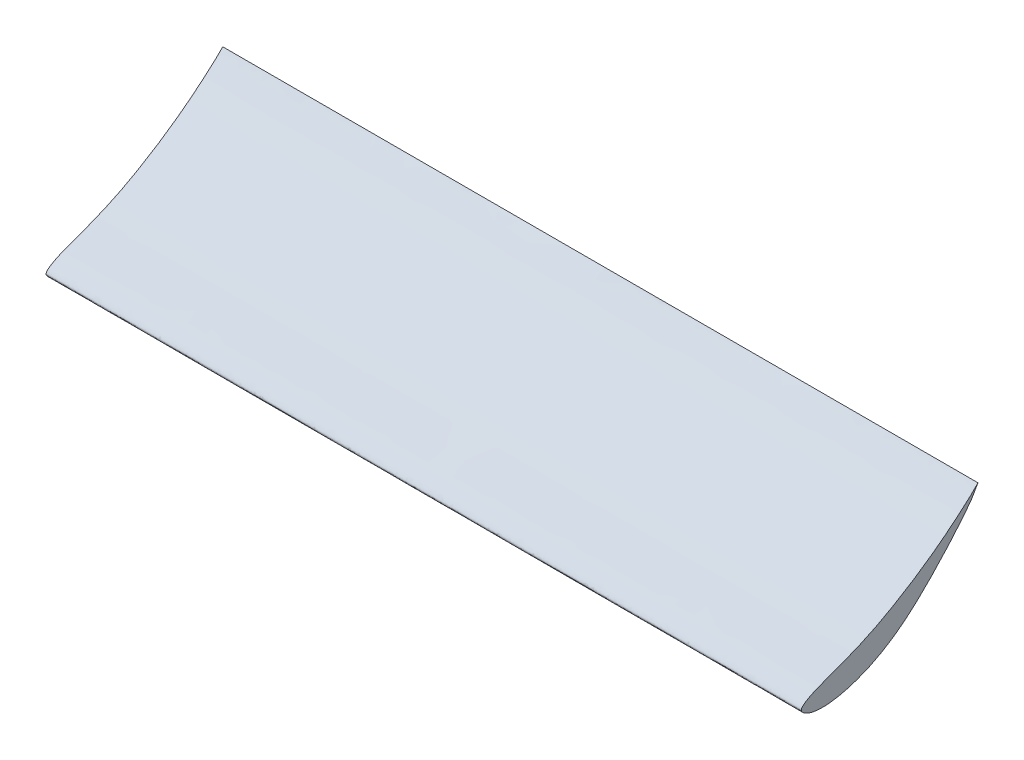
ISO-10303-21;
HEADER;
FILE_DESCRIPTION(('STEP AP214'),'2;1');
FILE_NAME('part.step','',(''),(''),'','','');
FILE_SCHEMA(('AUTOMOTIVE_DESIGN { 1 0 10303 214 1 1 1 1 }'));
ENDSEC;
DATA;
#1=APPLICATION_CONTEXT('core data for automotive mechanical design processes');
#2=APPLICATION_PROTOCOL_DEFINITION('international standard','automotive_design',2000,#1);
#3=PRODUCT_CONTEXT('',#1,'mechanical');
#4=PRODUCT('Part','Part','',(#3));
#5=PRODUCT_RELATED_PRODUCT_CATEGORY('part','',(#4));
#6=PRODUCT_DEFINITION_FORMATION('','',#4);
#7=PRODUCT_DEFINITION_CONTEXT('part definition',#1,'design');
#8=PRODUCT_DEFINITION('design','',#6,#7);
#9=PRODUCT_DEFINITION_SHAPE('','',#8);
#10=(LENGTH_UNIT() NAMED_UNIT(*) SI_UNIT(.MILLI.,.METRE.));
#11=(NAMED_UNIT(*) PLANE_ANGLE_UNIT() SI_UNIT($,.RADIAN.));
#12=(NAMED_UNIT(*) SI_UNIT($,.STERADIAN.) SOLID_ANGLE_UNIT());
#13=UNCERTAINTY_MEASURE_WITH_UNIT(LENGTH_MEASURE(1.E-05),#10,'distance_accuracy_value','');
#14=(GEOMETRIC_REPRESENTATION_CONTEXT(3) GLOBAL_UNCERTAINTY_ASSIGNED_CONTEXT((#13)) GLOBAL_UNIT_ASSIGNED_CONTEXT((#10,
#11,#12)) REPRESENTATION_CONTEXT('',''));
#15=CARTESIAN_POINT('',(0.,0.,0.));
#16=DIRECTION('',(0.,0.,1.));
#17=DIRECTION('',(1.,0.,0.));
#18=AXIS2_PLACEMENT_3D('',#15,#16,#17);
#19=CARTESIAN_POINT('',(-508.,983.23183406811,-902.866032271416));
#20=DIRECTION('',(-1.,0.,0.));
#21=DIRECTION('',(0.,0.,1.));
#22=AXIS2_PLACEMENT_3D('',#19,#20,#21);
#23=PLANE('',#22);
#24=CARTESIAN_POINT('',(-508.,1136.500000046,-1133.2478951966));
#25=CARTESIAN_POINT('',(-508.,1136.51866205503,-1133.22940707));
#26=CARTESIAN_POINT('',(-508.,1134.76729407548,-1131.73738322467));
#27=CARTESIAN_POINT('',(-508.,1133.14865361785,-1130.04521312581));
#28=CARTESIAN_POINT('',(-508.,1129.16246906123,-1126.03283655878));
#29=CARTESIAN_POINT('',(-508.,1124.47580071429,-1120.93333634314));
#30=CARTESIAN_POINT('',(-508.,1118.44426676079,-1114.21213755127));
#31=CARTESIAN_POINT('',(-508.,1111.46914157634,-1106.14181380977));
#32=CARTESIAN_POINT('',(-508.,1103.59085152631,-1096.66531267338));
#33=CARTESIAN_POINT('',(-508.,1094.99661592395,-1085.87423454851));
#34=CARTESIAN_POINT('',(-508.,1085.8664057438,-1073.8426942592));
#35=CARTESIAN_POINT('',(-508.,1076.45564659389,-1060.67966671591));
#36=CARTESIAN_POINT('',(-508.,1066.99203007372,-1046.56526822842));
#37=CARTESIAN_POINT('',(-508.,1057.62710879863,-1031.73778080715));
#38=CARTESIAN_POINT('',(-508.,1048.52286332666,-1016.40919832579));
#39=CARTESIAN_POINT('',(-508.,1039.89403724533,-1000.79537704153));
#40=CARTESIAN_POINT('',(-508.,1032.09727696124,-985.148163597457));
#41=CARTESIAN_POINT('',(-508.,1025.31827723405,-969.885579530069));
#42=CARTESIAN_POINT('',(-508.,1019.49450613905,-955.489755196973));
#43=CARTESIAN_POINT('',(-508.,1014.57372401878,-942.326496264695));
#44=CARTESIAN_POINT('',(-508.,1010.42738715633,-930.668912346977));
#45=CARTESIAN_POINT('',(-508.,1006.73545630894,-920.709876051195));
#46=CARTESIAN_POINT('',(-508.,1003.30962973556,-912.488425414251));
#47=CARTESIAN_POINT('',(-508.,1000.11328499534,-905.924711836648));
#48=CARTESIAN_POINT('',(-508.,997.12209295586,-900.987613441477));
#49=CARTESIAN_POINT('',(-508.,994.848485081599,-898.105542312802));
#50=CARTESIAN_POINT('',(-508.,993.323061343934,-896.747220150379));
#51=CARTESIAN_POINT('',(-508.,992.695678509163,-896.262963388353));
#52=CARTESIAN_POINT('',(-508.,992.128471885305,-895.906132308792));
#53=CARTESIAN_POINT('',(-508.,991.74202912273,-895.703357721575));
#54=CARTESIAN_POINT('',(-508.,991.439913457428,-895.58976608859));
#55=CARTESIAN_POINT('',(-508.,991.228782623257,-895.522464552237));
#56=CARTESIAN_POINT('',(-508.,991.020214241511,-895.477266270503));
#57=CARTESIAN_POINT('',(-508.,990.810606980497,-895.468104938629));
#58=CARTESIAN_POINT('',(-508.,990.597176067395,-895.477187864337));
#59=CARTESIAN_POINT('',(-508.,990.302571432088,-895.521281629362));
#60=CARTESIAN_POINT('',(-508.,989.921640587498,-895.605761956951));
#61=CARTESIAN_POINT('',(-508.,989.376327617136,-895.801661540054));
#62=CARTESIAN_POINT('',(-508.,988.324502311541,-896.307224772996));
#63=CARTESIAN_POINT('',(-508.,986.580020905351,-897.682020107552));
#64=CARTESIAN_POINT('',(-508.,984.731799572414,-900.007794247464));
#65=CARTESIAN_POINT('',(-508.,983.666890362432,-901.948697229946));
#66=CARTESIAN_POINT('',(-508.,983.23183406811,-902.866032271416));
#67=(BOUNDED_CURVE() B_SPLINE_CURVE(3,(#24,#25,#26,#27,#28,#29,#30,#31,#32,#33,#34,#35,#36,#37,
#38,#39,#40,#41,#42,#43,#44,#45,#46,#47,#48,#49,#50,#51,#52,#53,#54,#55,#56,#57,#58,#59,#60,#61,
#62,#63,#64,#65,#66),.UNSPECIFIED.,.F.,.F.) B_SPLINE_CURVE_WITH_KNOTS((4,1,1,1,1,1,1,1,1,1,1,1,
1,1,1,1,1,1,1,1,1,1,1,1,1,1,1,1,1,1,1,1,1,1,1,1,1,1,1,1,4),(0.,0.00184117619079416,
0.00730848433221432,0.016237150684669,0.0284563248120514,0.0438013684366982,0.0621258274692258,
0.0832395532130718,0.106895519252796,0.132816624078713,0.160612712000671,0.189791010160819,
0.219873156169979,0.250457487037601,0.28112655590443,0.311256566368928,0.339998753430789,
0.366671480309786,0.390812035384013,0.411995107228008,0.430068720119567,0.445223789458553,
0.457619352285403,0.467425396221126,0.474786479626527,0.476279684730584,0.477883716925066,
0.478839791717239,0.479711359314481,0.480113154439697,0.480492023942477,0.48084645603417,
0.481202586512776,0.481563638127212,0.481939611769679,0.482727347846705,0.483558571629405,
0.484902837311291,0.488691658546686,0.494806065890377,0.5),
.UNSPECIFIED.) CURVE() GEOMETRIC_REPRESENTATION_ITEM() RATIONAL_B_SPLINE_CURVE((1.,1.,1.,1.,1.,
1.,1.,1.,1.,1.,1.,1.,1.,1.,1.,1.,1.,1.,1.,1.,1.,1.,1.,1.,1.,1.,1.,1.,1.,1.,1.,1.,1.,1.,1.,1.,1.,
1.,1.,1.,1.,1.,1.)) REPRESENTATION_ITEM(''));
#68=CARTESIAN_POINT('',(-508.,1136.500000046,-1133.2478951966));
#69=VERTEX_POINT('',#68);
#70=CARTESIAN_POINT('',(-508.,983.23183406811,-902.866032271416));
#71=VERTEX_POINT('',#70);
#72=EDGE_CURVE('E10',#69,#71,#67,.T.);
#73=ORIENTED_EDGE('',*,*,#72,.F.);
#74=CARTESIAN_POINT('',(-508.,983.23183406811,-902.866032271416));
#75=CARTESIAN_POINT('',(-508.,983.051794016204,-903.245654519471));
#76=CARTESIAN_POINT('',(-508.,982.193962185146,-905.174738908225));
#77=CARTESIAN_POINT('',(-508.,980.947491558145,-909.044621195438));
#78=CARTESIAN_POINT('',(-508.,979.870416154282,-914.795542365219));
#79=CARTESIAN_POINT('',(-508.,979.346135741337,-921.395591653794));
#80=CARTESIAN_POINT('',(-508.,979.429810957453,-928.776843337677));
#81=CARTESIAN_POINT('',(-508.,980.159041889332,-936.860781778271));
#82=CARTESIAN_POINT('',(-508.,981.563117839808,-945.564210018201));
#83=CARTESIAN_POINT('',(-508.,983.658288216997,-954.794977359482));
#84=CARTESIAN_POINT('',(-508.,986.455957132716,-964.453768835694));
#85=CARTESIAN_POINT('',(-508.,989.95151803178,-974.43570168517));
#86=CARTESIAN_POINT('',(-508.,994.146079418227,-984.631289751938));
#87=CARTESIAN_POINT('',(-508.,999.067064719455,-994.928463859717));
#88=CARTESIAN_POINT('',(-508.,1004.71077269264,-1005.23476562102));
#89=CARTESIAN_POINT('',(-508.,1011.06861436425,-1015.47490404744));
#90=CARTESIAN_POINT('',(-508.,1018.12967538531,-1025.5791208222));
#91=CARTESIAN_POINT('',(-508.,1025.88232833701,-1035.50248612597));
#92=CARTESIAN_POINT('',(-508.,1034.28184113422,-1045.21746008474));
#93=CARTESIAN_POINT('',(-508.,1043.15012909835,-1054.77205505592));
#94=CARTESIAN_POINT('',(-508.,1052.32466752318,-1064.1447414051));
#95=CARTESIAN_POINT('',(-508.,1061.65160830308,-1073.25399801771));
#96=CARTESIAN_POINT('',(-508.,1070.96289931065,-1082.02526393335));
#97=CARTESIAN_POINT('',(-508.,1080.09941585938,-1090.37127690747));
#98=CARTESIAN_POINT('',(-508.,1088.91431720843,-1098.19257457962));
#99=CARTESIAN_POINT('',(-508.,1097.26041144891,-1105.39647498838));
#100=CARTESIAN_POINT('',(-508.,1105.00816359892,-1111.87692251879));
#101=CARTESIAN_POINT('',(-508.,1112.05162823055,-1117.54059155859));
#102=CARTESIAN_POINT('',(-508.,1118.31282016739,-1122.28985209627));
#103=CARTESIAN_POINT('',(-508.,1123.94756936492,-1126.05528055917));
#104=CARTESIAN_POINT('',(-508.,1128.69826829572,-1128.73587721306));
#105=CARTESIAN_POINT('',(-508.,1132.83122267032,-1131.03774052774));
#106=CARTESIAN_POINT('',(-508.,1134.71203322922,-1132.01470797932));
#107=CARTESIAN_POINT('',(-508.,1136.48162676212,-1133.26609728824));
#108=CARTESIAN_POINT('',(-508.,1136.500000046,-1133.2478951966));
#109=(BOUNDED_CURVE() B_SPLINE_CURVE(3,(#74,#75,#76,#77,#78,#79,#80,#81,#82,#83,#84,#85,#86,#87,
#88,#89,#90,#91,#92,#93,#94,#95,#96,#97,#98,#99,#100,#101,#102,#103,#104,#105,#106,#107,#108),
.UNSPECIFIED.,.F.,.F.) B_SPLINE_CURVE_WITH_KNOTS((4,1,1,1,1,1,1,1,1,1,1,1,1,1,1,1,1,1,1,1,1,1,1,
1,1,1,1,1,1,1,1,1,4),(0.5,0.50214941417673,0.51079641033661,0.52076411711489,0.532061880680993,
0.544665778051845,0.558541303758952,0.573611819486058,0.589802913486935,0.607010013605937,
0.625106991651802,0.643966630087001,0.663469283837628,0.683551422114583,0.704141715386998,
0.725196116617036,0.746680344678811,0.76863295082579,0.790977273416519,0.813463266282734,
0.835826600861633,0.857771602761782,0.879002654996971,0.899227861132971,0.918150719215499,
0.935487384590744,0.950986920125746,0.964427757613896,0.97582785740124,0.985423652020086,
0.993088671814056,0.998187309160131,1.),
.UNSPECIFIED.) CURVE() GEOMETRIC_REPRESENTATION_ITEM() RATIONAL_B_SPLINE_CURVE((1.,1.,1.,1.,1.,
1.,1.,1.,1.,1.,1.,1.,1.,1.,1.,1.,1.,1.,1.,1.,1.,1.,1.,1.,1.,1.,1.,1.,1.,1.,1.,1.,1.,1.,1.)) REPRESENTATION_ITEM(''));
#110=EDGE_CURVE('E66',#71,#69,#109,.T.);
#111=ORIENTED_EDGE('',*,*,#110,.F.);
#112=EDGE_LOOP('',(#73,#111));
#113=FACE_BOUND('',#112,.T.);
#114=ADVANCED_FACE('F16',(#113),#23,.T.);
#115=CARTESIAN_POINT('',(508.,983.23183406811,-902.866032271416));
#116=DIRECTION('',(-1.,0.,0.));
#117=DIRECTION('',(0.,0.,1.));
#118=AXIS2_PLACEMENT_3D('',#115,#116,#117);
#119=PLANE('',#118);
#120=CARTESIAN_POINT('',(508.,1136.500000046,-1133.2478951966));
#121=CARTESIAN_POINT('',(508.,1136.51866205503,-1133.22940707));
#122=CARTESIAN_POINT('',(508.,1134.76729407548,-1131.73738322467));
#123=CARTESIAN_POINT('',(508.,1133.14865361785,-1130.04521312581));
#124=CARTESIAN_POINT('',(508.,1129.16246906123,-1126.03283655878));
#125=CARTESIAN_POINT('',(508.,1124.47580071429,-1120.93333634314));
#126=CARTESIAN_POINT('',(508.,1118.44426676079,-1114.21213755127));
#127=CARTESIAN_POINT('',(508.,1111.46914157634,-1106.14181380977));
#128=CARTESIAN_POINT('',(508.,1103.59085152631,-1096.66531267338));
#129=CARTESIAN_POINT('',(508.,1094.99661592395,-1085.87423454851));
#130=CARTESIAN_POINT('',(508.,1085.8664057438,-1073.8426942592));
#131=CARTESIAN_POINT('',(508.,1076.45564659389,-1060.67966671591));
#132=CARTESIAN_POINT('',(508.,1066.99203007372,-1046.56526822842));
#133=CARTESIAN_POINT('',(508.,1057.62710879863,-1031.73778080715));
#134=CARTESIAN_POINT('',(508.,1048.52286332666,-1016.40919832579));
#135=CARTESIAN_POINT('',(508.,1039.89403724533,-1000.79537704153));
#136=CARTESIAN_POINT('',(508.,1032.09727696124,-985.148163597457));
#137=CARTESIAN_POINT('',(508.,1025.31827723405,-969.885579530069));
#138=CARTESIAN_POINT('',(508.,1019.49450613905,-955.489755196973));
#139=CARTESIAN_POINT('',(508.,1014.57372401878,-942.326496264695));
#140=CARTESIAN_POINT('',(508.,1010.42738715633,-930.668912346977));
#141=CARTESIAN_POINT('',(508.,1006.73545630894,-920.709876051195));
#142=CARTESIAN_POINT('',(508.,1003.30962973556,-912.488425414251));
#143=CARTESIAN_POINT('',(508.,1000.11328499534,-905.924711836648));
#144=CARTESIAN_POINT('',(508.,997.12209295586,-900.987613441477));
#145=CARTESIAN_POINT('',(508.,994.848485081599,-898.105542312802));
#146=CARTESIAN_POINT('',(508.,993.323061343934,-896.747220150379));
#147=CARTESIAN_POINT('',(508.,992.695678509163,-896.262963388353));
#148=CARTESIAN_POINT('',(508.,992.128471885305,-895.906132308792));
#149=CARTESIAN_POINT('',(508.,991.74202912273,-895.703357721575));
#150=CARTESIAN_POINT('',(508.,991.439913457428,-895.58976608859));
#151=CARTESIAN_POINT('',(508.,991.228782623257,-895.522464552237));
#152=CARTESIAN_POINT('',(508.,991.020214241511,-895.477266270503));
#153=CARTESIAN_POINT('',(508.,990.810606980497,-895.468104938629));
#154=CARTESIAN_POINT('',(508.,990.597176067395,-895.477187864337));
#155=CARTESIAN_POINT('',(508.,990.302571432088,-895.521281629362));
#156=CARTESIAN_POINT('',(508.,989.921640587498,-895.605761956951));
#157=CARTESIAN_POINT('',(508.,989.376327617136,-895.801661540054));
#158=CARTESIAN_POINT('',(508.,988.324502311541,-896.307224772996));
#159=CARTESIAN_POINT('',(508.,986.580020905351,-897.682020107552));
#160=CARTESIAN_POINT('',(508.,984.731799572414,-900.007794247464));
#161=CARTESIAN_POINT('',(508.,983.666890362432,-901.948697229946));
#162=CARTESIAN_POINT('',(508.,983.23183406811,-902.866032271416));
#163=(BOUNDED_CURVE() B_SPLINE_CURVE(3,(#120,#121,#122,#123,#124,#125,#126,#127,#128,#129,#130,
#131,#132,#133,#134,#135,#136,#137,#138,#139,#140,#141,#142,#143,#144,#145,#146,#147,#148,#149,
#150,#151,#152,#153,#154,#155,#156,#157,#158,#159,#160,#161,#162),.UNSPECIFIED.,.F.,
.F.) B_SPLINE_CURVE_WITH_KNOTS((4,1,1,1,1,1,1,1,1,1,1,1,1,1,1,1,1,1,1,1,1,1,1,1,1,1,1,1,1,1,1,1,
1,1,1,1,1,1,1,1,4),(0.,0.00184117619079416,0.00730848433221432,0.016237150684669,
0.0284563248120514,0.0438013684366982,0.0621258274692258,0.0832395532130718,0.106895519252796,
0.132816624078713,0.160612712000671,0.189791010160819,0.219873156169979,0.250457487037601,
0.28112655590443,0.311256566368928,0.339998753430789,0.366671480309786,0.390812035384013,
0.411995107228008,0.430068720119567,0.445223789458553,0.457619352285403,0.467425396221126,
0.474786479626527,0.476279684730584,0.477883716925066,0.478839791717239,0.479711359314481,
0.480113154439697,0.480492023942477,0.48084645603417,0.481202586512776,0.481563638127212,
0.481939611769679,0.482727347846705,0.483558571629405,0.484902837311291,0.488691658546686,
0.494806065890377,0.5),
.UNSPECIFIED.) CURVE() GEOMETRIC_REPRESENTATION_ITEM() RATIONAL_B_SPLINE_CURVE((1.,1.,1.,1.,1.,
1.,1.,1.,1.,1.,1.,1.,1.,1.,1.,1.,1.,1.,1.,1.,1.,1.,1.,1.,1.,1.,1.,1.,1.,1.,1.,1.,1.,1.,1.,1.,1.,
1.,1.,1.,1.,1.,1.)) REPRESENTATION_ITEM(''));
#164=CARTESIAN_POINT('',(508.,1136.500000046,-1133.2478951966));
#165=VERTEX_POINT('',#164);
#166=CARTESIAN_POINT('',(508.,983.23183406811,-902.866032271416));
#167=VERTEX_POINT('',#166);
#168=EDGE_CURVE('E25',#165,#167,#163,.T.);
#169=ORIENTED_EDGE('',*,*,#168,.T.);
#170=CARTESIAN_POINT('',(508.,983.23183406811,-902.866032271416));
#171=CARTESIAN_POINT('',(508.,983.051794016204,-903.245654519471));
#172=CARTESIAN_POINT('',(508.,982.193962185146,-905.174738908225));
#173=CARTESIAN_POINT('',(508.,980.947491558145,-909.044621195438));
#174=CARTESIAN_POINT('',(508.,979.870416154282,-914.795542365219));
#175=CARTESIAN_POINT('',(508.,979.346135741337,-921.395591653794));
#176=CARTESIAN_POINT('',(508.,979.429810957453,-928.776843337677));
#177=CARTESIAN_POINT('',(508.,980.159041889332,-936.860781778271));
#178=CARTESIAN_POINT('',(508.,981.563117839808,-945.564210018201));
#179=CARTESIAN_POINT('',(508.,983.658288216997,-954.794977359482));
#180=CARTESIAN_POINT('',(508.,986.455957132716,-964.453768835694));
#181=CARTESIAN_POINT('',(508.,989.95151803178,-974.43570168517));
#182=CARTESIAN_POINT('',(508.,994.146079418227,-984.631289751938));
#183=CARTESIAN_POINT('',(508.,999.067064719455,-994.928463859717));
#184=CARTESIAN_POINT('',(508.,1004.71077269264,-1005.23476562102));
#185=CARTESIAN_POINT('',(508.,1011.06861436425,-1015.47490404744));
#186=CARTESIAN_POINT('',(508.,1018.12967538531,-1025.5791208222));
#187=CARTESIAN_POINT('',(508.,1025.88232833701,-1035.50248612597));
#188=CARTESIAN_POINT('',(508.,1034.28184113422,-1045.21746008474));
#189=CARTESIAN_POINT('',(508.,1043.15012909835,-1054.77205505592));
#190=CARTESIAN_POINT('',(508.,1052.32466752318,-1064.1447414051));
#191=CARTESIAN_POINT('',(508.,1061.65160830308,-1073.25399801771));
#192=CARTESIAN_POINT('',(508.,1070.96289931065,-1082.02526393335));
#193=CARTESIAN_POINT('',(508.,1080.09941585938,-1090.37127690747));
#194=CARTESIAN_POINT('',(508.,1088.91431720843,-1098.19257457962));
#195=CARTESIAN_POINT('',(508.,1097.26041144891,-1105.39647498838));
#196=CARTESIAN_POINT('',(508.,1105.00816359892,-1111.87692251879));
#197=CARTESIAN_POINT('',(508.,1112.05162823055,-1117.54059155859));
#198=CARTESIAN_POINT('',(508.,1118.31282016739,-1122.28985209627));
#199=CARTESIAN_POINT('',(508.,1123.94756936492,-1126.05528055917));
#200=CARTESIAN_POINT('',(508.,1128.69826829572,-1128.73587721306));
#201=CARTESIAN_POINT('',(508.,1132.83122267032,-1131.03774052774));
#202=CARTESIAN_POINT('',(508.,1134.71203322922,-1132.01470797932));
#203=CARTESIAN_POINT('',(508.,1136.48162676212,-1133.26609728824));
#204=CARTESIAN_POINT('',(508.,1136.500000046,-1133.2478951966));
#205=(BOUNDED_CURVE() B_SPLINE_CURVE(3,(#170,#171,#172,#173,#174,#175,#176,#177,#178,#179,#180,
#181,#182,#183,#184,#185,#186,#187,#188,#189,#190,#191,#192,#193,#194,#195,#196,#197,#198,#199,
#200,#201,#202,#203,#204),.UNSPECIFIED.,.F.,.F.) B_SPLINE_CURVE_WITH_KNOTS((4,1,1,1,1,1,1,1,1,1,
1,1,1,1,1,1,1,1,1,1,1,1,1,1,1,1,1,1,1,1,1,1,4),(0.5,0.50214941417673,0.51079641033661,
0.52076411711489,0.532061880680993,0.544665778051845,0.558541303758952,0.573611819486058,
0.589802913486935,0.607010013605937,0.625106991651802,0.643966630087001,0.663469283837628,
0.683551422114583,0.704141715386998,0.725196116617036,0.746680344678811,0.76863295082579,
0.790977273416519,0.813463266282734,0.835826600861633,0.857771602761782,0.879002654996971,
0.899227861132971,0.918150719215499,0.935487384590744,0.950986920125746,0.964427757613896,
0.97582785740124,0.985423652020086,0.993088671814056,0.998187309160131,1.),
.UNSPECIFIED.) CURVE() GEOMETRIC_REPRESENTATION_ITEM() RATIONAL_B_SPLINE_CURVE((1.,1.,1.,1.,1.,
1.,1.,1.,1.,1.,1.,1.,1.,1.,1.,1.,1.,1.,1.,1.,1.,1.,1.,1.,1.,1.,1.,1.,1.,1.,1.,1.,1.,1.,1.)) REPRESENTATION_ITEM(''));
#206=EDGE_CURVE('E56',#167,#165,#205,.T.);
#207=ORIENTED_EDGE('',*,*,#206,.T.);
#208=EDGE_LOOP('',(#169,#207));
#209=FACE_BOUND('',#208,.T.);
#210=ADVANCED_FACE('F54',(#209),#119,.F.);
#211=CARTESIAN_POINT('',(508.,1136.500000046,-1133.2478951966));
#212=CARTESIAN_POINT('',(-508.,1136.500000046,-1133.2478951966));
#213=CARTESIAN_POINT('',(508.,1136.51866205503,-1133.22940707));
#214=CARTESIAN_POINT('',(-508.,1136.51866205503,-1133.22940707));
#215=CARTESIAN_POINT('',(508.,1134.76729407548,-1131.73738322467));
#216=CARTESIAN_POINT('',(-508.,1134.76729407548,-1131.73738322467));
#217=CARTESIAN_POINT('',(508.,1133.14865361785,-1130.04521312581));
#218=CARTESIAN_POINT('',(-508.,1133.14865361785,-1130.04521312581));
#219=CARTESIAN_POINT('',(508.,1129.16246906123,-1126.03283655878));
#220=CARTESIAN_POINT('',(-508.,1129.16246906123,-1126.03283655878));
#221=CARTESIAN_POINT('',(508.,1124.47580071429,-1120.93333634314));
#222=CARTESIAN_POINT('',(-508.,1124.47580071429,-1120.93333634314));
#223=CARTESIAN_POINT('',(508.,1118.44426676079,-1114.21213755127));
#224=CARTESIAN_POINT('',(-508.,1118.44426676079,-1114.21213755127));
#225=CARTESIAN_POINT('',(508.,1111.46914157634,-1106.14181380977));
#226=CARTESIAN_POINT('',(-508.,1111.46914157634,-1106.14181380977));
#227=CARTESIAN_POINT('',(508.,1103.59085152631,-1096.66531267338));
#228=CARTESIAN_POINT('',(-508.,1103.59085152631,-1096.66531267338));
#229=CARTESIAN_POINT('',(508.,1094.99661592395,-1085.87423454851));
#230=CARTESIAN_POINT('',(-508.,1094.99661592395,-1085.87423454851));
#231=CARTESIAN_POINT('',(508.,1085.8664057438,-1073.8426942592));
#232=CARTESIAN_POINT('',(-508.,1085.8664057438,-1073.8426942592));
#233=CARTESIAN_POINT('',(508.,1076.45564659389,-1060.67966671591));
#234=CARTESIAN_POINT('',(-508.,1076.45564659389,-1060.67966671591));
#235=CARTESIAN_POINT('',(508.,1066.99203007372,-1046.56526822842));
#236=CARTESIAN_POINT('',(-508.,1066.99203007372,-1046.56526822842));
#237=CARTESIAN_POINT('',(508.,1057.62710879863,-1031.73778080715));
#238=CARTESIAN_POINT('',(-508.,1057.62710879863,-1031.73778080715));
#239=CARTESIAN_POINT('',(508.,1048.52286332666,-1016.40919832579));
#240=CARTESIAN_POINT('',(-508.,1048.52286332666,-1016.40919832579));
#241=CARTESIAN_POINT('',(508.,1039.89403724533,-1000.79537704153));
#242=CARTESIAN_POINT('',(-508.,1039.89403724533,-1000.79537704153));
#243=CARTESIAN_POINT('',(508.,1032.09727696124,-985.148163597457));
#244=CARTESIAN_POINT('',(-508.,1032.09727696124,-985.148163597457));
#245=CARTESIAN_POINT('',(508.,1025.31827723405,-969.885579530069));
#246=CARTESIAN_POINT('',(-508.,1025.31827723405,-969.885579530069));
#247=CARTESIAN_POINT('',(508.,1019.49450613905,-955.489755196973));
#248=CARTESIAN_POINT('',(-508.,1019.49450613905,-955.489755196973));
#249=CARTESIAN_POINT('',(508.,1014.57372401878,-942.326496264695));
#250=CARTESIAN_POINT('',(-508.,1014.57372401878,-942.326496264695));
#251=CARTESIAN_POINT('',(508.,1010.42738715633,-930.668912346977));
#252=CARTESIAN_POINT('',(-508.,1010.42738715633,-930.668912346977));
#253=CARTESIAN_POINT('',(508.,1006.73545630894,-920.709876051195));
#254=CARTESIAN_POINT('',(-508.,1006.73545630894,-920.709876051195));
#255=CARTESIAN_POINT('',(508.,1003.30962973556,-912.488425414251));
#256=CARTESIAN_POINT('',(-508.,1003.30962973556,-912.488425414251));
#257=CARTESIAN_POINT('',(508.,1000.11328499534,-905.924711836648));
#258=CARTESIAN_POINT('',(-508.,1000.11328499534,-905.924711836648));
#259=CARTESIAN_POINT('',(508.,997.12209295586,-900.987613441477));
#260=CARTESIAN_POINT('',(-508.,997.12209295586,-900.987613441477));
#261=CARTESIAN_POINT('',(508.,994.848485081599,-898.105542312802));
#262=CARTESIAN_POINT('',(-508.,994.848485081599,-898.105542312802));
#263=CARTESIAN_POINT('',(508.,993.323061343934,-896.747220150379));
#264=CARTESIAN_POINT('',(-508.,993.323061343934,-896.747220150379));
#265=CARTESIAN_POINT('',(508.,992.695678509163,-896.262963388353));
#266=CARTESIAN_POINT('',(-508.,992.695678509163,-896.262963388353));
#267=CARTESIAN_POINT('',(508.,992.128471885305,-895.906132308792));
#268=CARTESIAN_POINT('',(-508.,992.128471885305,-895.906132308792));
#269=CARTESIAN_POINT('',(508.,991.74202912273,-895.703357721575));
#270=CARTESIAN_POINT('',(-508.,991.74202912273,-895.703357721575));
#271=CARTESIAN_POINT('',(508.,991.439913457428,-895.58976608859));
#272=CARTESIAN_POINT('',(-508.,991.439913457428,-895.58976608859));
#273=CARTESIAN_POINT('',(508.,991.228782623257,-895.522464552237));
#274=CARTESIAN_POINT('',(-508.,991.228782623257,-895.522464552237));
#275=CARTESIAN_POINT('',(508.,991.020214241511,-895.477266270503));
#276=CARTESIAN_POINT('',(-508.,991.020214241511,-895.477266270503));
#277=CARTESIAN_POINT('',(508.,990.810606980497,-895.468104938629));
#278=CARTESIAN_POINT('',(-508.,990.810606980497,-895.468104938629));
#279=CARTESIAN_POINT('',(508.,990.597176067395,-895.477187864337));
#280=CARTESIAN_POINT('',(-508.,990.597176067395,-895.477187864337));
#281=CARTESIAN_POINT('',(508.,990.302571432088,-895.521281629362));
#282=CARTESIAN_POINT('',(-508.,990.302571432088,-895.521281629362));
#283=CARTESIAN_POINT('',(508.,989.921640587498,-895.605761956951));
#284=CARTESIAN_POINT('',(-508.,989.921640587498,-895.605761956951));
#285=CARTESIAN_POINT('',(508.,989.376327617136,-895.801661540054));
#286=CARTESIAN_POINT('',(-508.,989.376327617136,-895.801661540054));
#287=CARTESIAN_POINT('',(508.,988.324502311541,-896.307224772996));
#288=CARTESIAN_POINT('',(-508.,988.324502311541,-896.307224772996));
#289=CARTESIAN_POINT('',(508.,986.580020905351,-897.682020107552));
#290=CARTESIAN_POINT('',(-508.,986.580020905351,-897.682020107552));
#291=CARTESIAN_POINT('',(508.,984.731799572414,-900.007794247464));
#292=CARTESIAN_POINT('',(-508.,984.731799572414,-900.007794247464));
#293=CARTESIAN_POINT('',(508.,983.666890362432,-901.948697229946));
#294=CARTESIAN_POINT('',(-508.,983.666890362432,-901.948697229946));
#295=CARTESIAN_POINT('',(508.,983.23183406811,-902.866032271416));
#296=CARTESIAN_POINT('',(-508.,983.23183406811,-902.866032271416));
#297=(BOUNDED_SURFACE() B_SPLINE_SURFACE(3,1,((#211,#212),(#213,#214),(#215,#216),(#217,#218),
(#219,#220),(#221,#222),(#223,#224),(#225,#226),(#227,#228),(#229,#230),(#231,#232),(#233,#234),
(#235,#236),(#237,#238),(#239,#240),(#241,#242),(#243,#244),(#245,#246),(#247,#248),(#249,#250),
(#251,#252),(#253,#254),(#255,#256),(#257,#258),(#259,#260),(#261,#262),(#263,#264),(#265,#266),
(#267,#268),(#269,#270),(#271,#272),(#273,#274),(#275,#276),(#277,#278),(#279,#280),(#281,#282),
(#283,#284),(#285,#286),(#287,#288),(#289,#290),(#291,#292),(#293,#294),(#295,#296)),
.UNSPECIFIED.,.F.,.F.,.F.) B_SPLINE_SURFACE_WITH_KNOTS((4,1,1,1,1,1,1,1,1,1,1,1,1,1,1,1,1,1,1,1,
1,1,1,1,1,1,1,1,1,1,1,1,1,1,1,1,1,1,1,1,4),(2,2),(0.,0.00184117619079416,0.00730848433221432,
0.016237150684669,0.0284563248120514,0.0438013684366982,0.0621258274692258,0.0832395532130718,
0.106895519252796,0.132816624078713,0.160612712000671,0.189791010160819,0.219873156169979,
0.250457487037601,0.28112655590443,0.311256566368928,0.339998753430789,0.366671480309786,
0.390812035384013,0.411995107228008,0.430068720119567,0.445223789458553,0.457619352285403,
0.467425396221126,0.474786479626527,0.476279684730584,0.477883716925066,0.478839791717239,
0.479711359314481,0.480113154439697,0.480492023942477,0.48084645603417,0.481202586512776,
0.481563638127212,0.481939611769679,0.482727347846705,0.483558571629405,0.484902837311291,
0.488691658546686,0.494806065890377,0.5),(0.,1.),
.UNSPECIFIED.) GEOMETRIC_REPRESENTATION_ITEM() RATIONAL_B_SPLINE_SURFACE(((1.,1.),(1.,1.),(1.,
1.),(1.,1.),(1.,1.),(1.,1.),(1.,1.),(1.,1.),(1.,1.),(1.,1.),(1.,1.),(1.,1.),(1.,1.),(1.,1.),(1.,
1.),(1.,1.),(1.,1.),(1.,1.),(1.,1.),(1.,1.),(1.,1.),(1.,1.),(1.,1.),(1.,1.),(1.,1.),(1.,1.),(1.,
1.),(1.,1.),(1.,1.),(1.,1.),(1.,1.),(1.,1.),(1.,1.),(1.,1.),(1.,1.),(1.,1.),(1.,1.),(1.,1.),(1.,
1.),(1.,1.),(1.,1.),(1.,1.),(1.,1.))) REPRESENTATION_ITEM('') SURFACE());
#298=DIRECTION('',(-1.,0.,0.));
#299=VECTOR('',#298,1.);
#300=CARTESIAN_POINT('',(508.,983.23183406811,-902.866032271416));
#301=LINE('',#300,#299);
#302=EDGE_CURVE('E61',#167,#71,#301,.T.);
#303=DIRECTION('',(-1.,0.,0.));
#304=VECTOR('',#303,1.);
#305=CARTESIAN_POINT('',(508.,1136.500000046,-1133.2478951966));
#306=LINE('',#305,#304);
#307=EDGE_CURVE('E19',#165,#69,#306,.T.);
#308=ORIENTED_EDGE('',*,*,#302,.F.);
#309=ORIENTED_EDGE('',*,*,#168,.F.);
#310=ORIENTED_EDGE('',*,*,#307,.T.);
#311=ORIENTED_EDGE('',*,*,#72,.T.);
#312=EDGE_LOOP('',(#308,#309,#310,#311));
#313=FACE_BOUND('',#312,.T.);
#314=ADVANCED_FACE('F62',(#313),#297,.F.);
#315=CARTESIAN_POINT('',(508.,983.231834073813,-902.86603225939));
#316=CARTESIAN_POINT('',(-508.,983.231834073813,-902.86603225939));
#317=CARTESIAN_POINT('',(508.,983.051794019811,-903.245654511361));
#318=CARTESIAN_POINT('',(-508.,983.051794019811,-903.245654511361));
#319=CARTESIAN_POINT('',(508.,982.193962186508,-905.174738903995));
#320=CARTESIAN_POINT('',(-508.,982.193962186508,-905.174738903995));
#321=CARTESIAN_POINT('',(508.,980.947491558145,-909.044621195438));
#322=CARTESIAN_POINT('',(-508.,980.947491558145,-909.044621195438));
#323=CARTESIAN_POINT('',(508.,979.870416154282,-914.795542365219));
#324=CARTESIAN_POINT('',(-508.,979.870416154282,-914.795542365219));
#325=CARTESIAN_POINT('',(508.,979.346135741337,-921.395591653794));
#326=CARTESIAN_POINT('',(-508.,979.346135741337,-921.395591653794));
#327=CARTESIAN_POINT('',(508.,979.429810957453,-928.776843337677));
#328=CARTESIAN_POINT('',(-508.,979.429810957453,-928.776843337677));
#329=CARTESIAN_POINT('',(508.,980.159041889332,-936.860781778271));
#330=CARTESIAN_POINT('',(-508.,980.159041889332,-936.860781778271));
#331=CARTESIAN_POINT('',(508.,981.563117839808,-945.564210018201));
#332=CARTESIAN_POINT('',(-508.,981.563117839808,-945.564210018201));
#333=CARTESIAN_POINT('',(508.,983.658288216997,-954.794977359482));
#334=CARTESIAN_POINT('',(-508.,983.658288216997,-954.794977359482));
#335=CARTESIAN_POINT('',(508.,986.455957132716,-964.453768835694));
#336=CARTESIAN_POINT('',(-508.,986.455957132716,-964.453768835694));
#337=CARTESIAN_POINT('',(508.,989.95151803178,-974.43570168517));
#338=CARTESIAN_POINT('',(-508.,989.95151803178,-974.43570168517));
#339=CARTESIAN_POINT('',(508.,994.146079418227,-984.631289751938));
#340=CARTESIAN_POINT('',(-508.,994.146079418227,-984.631289751938));
#341=CARTESIAN_POINT('',(508.,999.067064719455,-994.928463859717));
#342=CARTESIAN_POINT('',(-508.,999.067064719455,-994.928463859717));
#343=CARTESIAN_POINT('',(508.,1004.71077269264,-1005.23476562102));
#344=CARTESIAN_POINT('',(-508.,1004.71077269264,-1005.23476562102));
#345=CARTESIAN_POINT('',(508.,1011.06861436425,-1015.47490404744));
#346=CARTESIAN_POINT('',(-508.,1011.06861436425,-1015.47490404744));
#347=CARTESIAN_POINT('',(508.,1018.12967538531,-1025.5791208222));
#348=CARTESIAN_POINT('',(-508.,1018.12967538531,-1025.5791208222));
#349=CARTESIAN_POINT('',(508.,1025.88232833701,-1035.50248612597));
#350=CARTESIAN_POINT('',(-508.,1025.88232833701,-1035.50248612597));
#351=CARTESIAN_POINT('',(508.,1034.28184113422,-1045.21746008474));
#352=CARTESIAN_POINT('',(-508.,1034.28184113422,-1045.21746008474));
#353=CARTESIAN_POINT('',(508.,1043.15012909835,-1054.77205505592));
#354=CARTESIAN_POINT('',(-508.,1043.15012909835,-1054.77205505592));
#355=CARTESIAN_POINT('',(508.,1052.32466752318,-1064.1447414051));
#356=CARTESIAN_POINT('',(-508.,1052.32466752318,-1064.1447414051));
#357=CARTESIAN_POINT('',(508.,1061.65160830308,-1073.25399801771));
#358=CARTESIAN_POINT('',(-508.,1061.65160830308,-1073.25399801771));
#359=CARTESIAN_POINT('',(508.,1070.96289931065,-1082.02526393335));
#360=CARTESIAN_POINT('',(-508.,1070.96289931065,-1082.02526393335));
#361=CARTESIAN_POINT('',(508.,1080.09941585938,-1090.37127690747));
#362=CARTESIAN_POINT('',(-508.,1080.09941585938,-1090.37127690747));
#363=CARTESIAN_POINT('',(508.,1088.91431720843,-1098.19257457962));
#364=CARTESIAN_POINT('',(-508.,1088.91431720843,-1098.19257457962));
#365=CARTESIAN_POINT('',(508.,1097.26041144891,-1105.39647498838));
#366=CARTESIAN_POINT('',(-508.,1097.26041144891,-1105.39647498838));
#367=CARTESIAN_POINT('',(508.,1105.00816359892,-1111.87692251879));
#368=CARTESIAN_POINT('',(-508.,1105.00816359892,-1111.87692251879));
#369=CARTESIAN_POINT('',(508.,1112.05162823055,-1117.54059155859));
#370=CARTESIAN_POINT('',(-508.,1112.05162823055,-1117.54059155859));
#371=CARTESIAN_POINT('',(508.,1118.31282016739,-1122.28985209627));
#372=CARTESIAN_POINT('',(-508.,1118.31282016739,-1122.28985209627));
#373=CARTESIAN_POINT('',(508.,1123.94756936492,-1126.05528055917));
#374=CARTESIAN_POINT('',(-508.,1123.94756936492,-1126.05528055917));
#375=CARTESIAN_POINT('',(508.,1128.69826829572,-1128.73587721306));
#376=CARTESIAN_POINT('',(-508.,1128.69826829572,-1128.73587721306));
#377=CARTESIAN_POINT('',(508.,1132.83122267032,-1131.03774052774));
#378=CARTESIAN_POINT('',(-508.,1132.83122267032,-1131.03774052774));
#379=CARTESIAN_POINT('',(508.,1134.71203322922,-1132.01470797932));
#380=CARTESIAN_POINT('',(-508.,1134.71203322922,-1132.01470797932));
#381=CARTESIAN_POINT('',(508.,1136.48162676212,-1133.26609728824));
#382=CARTESIAN_POINT('',(-508.,1136.48162676212,-1133.26609728824));
#383=CARTESIAN_POINT('',(508.,1136.500000046,-1133.2478951966));
#384=CARTESIAN_POINT('',(-508.,1136.500000046,-1133.2478951966));
#385=(BOUNDED_SURFACE() B_SPLINE_SURFACE(3,1,((#315,#316),(#317,#318),(#319,#320),(#321,#322),
(#323,#324),(#325,#326),(#327,#328),(#329,#330),(#331,#332),(#333,#334),(#335,#336),(#337,#338),
(#339,#340),(#341,#342),(#343,#344),(#345,#346),(#347,#348),(#349,#350),(#351,#352),(#353,#354),
(#355,#356),(#357,#358),(#359,#360),(#361,#362),(#363,#364),(#365,#366),(#367,#368),(#369,#370),
(#371,#372),(#373,#374),(#375,#376),(#377,#378),(#379,#380),(#381,#382),(#383,#384)),
.UNSPECIFIED.,.F.,.F.,.F.) B_SPLINE_SURFACE_WITH_KNOTS((4,1,1,1,1,1,1,1,1,1,1,1,1,1,1,1,1,1,1,1,
1,1,1,1,1,1,1,1,1,1,1,1,4),(2,2),(0.499999999977304,0.50214941417673,0.51079641033661,
0.52076411711489,0.532061880680993,0.544665778051845,0.558541303758952,0.573611819486058,
0.589802913486935,0.607010013605937,0.625106991651802,0.643966630087001,0.663469283837628,
0.683551422114583,0.704141715386998,0.725196116617036,0.746680344678811,0.76863295082579,
0.790977273416519,0.813463266282734,0.835826600861633,0.857771602761782,0.879002654996971,
0.899227861132971,0.918150719215499,0.935487384590744,0.950986920125746,0.964427757613896,
0.97582785740124,0.985423652020086,0.993088671814056,0.998187309160131,1.00000000320056),(0.,
1.),.UNSPECIFIED.) GEOMETRIC_REPRESENTATION_ITEM() RATIONAL_B_SPLINE_SURFACE(((1.,1.),(1.,1.),
(1.,1.),(1.,1.),(1.,1.),(1.,1.),(1.,1.),(1.,1.),(1.,1.),(1.,1.),(1.,1.),(1.,1.),(1.,1.),(1.,1.),
(1.,1.),(1.,1.),(1.,1.),(1.,1.),(1.,1.),(1.,1.),(1.,1.),(1.,1.),(1.,1.),(1.,1.),(1.,1.),(1.,1.),
(1.,1.),(1.,1.),(1.,1.),(1.,1.),(1.,1.),(1.,1.),(1.,1.),(1.,1.),(1.,1.))) REPRESENTATION_ITEM('') SURFACE());
#386=ORIENTED_EDGE('',*,*,#206,.F.);
#387=ORIENTED_EDGE('',*,*,#302,.T.);
#388=ORIENTED_EDGE('',*,*,#110,.T.);
#389=ORIENTED_EDGE('',*,*,#307,.F.);
#390=EDGE_LOOP('',(#386,#387,#388,#389));
#391=FACE_BOUND('',#390,.T.);
#392=ADVANCED_FACE('F68',(#391),#385,.F.);
#393=CLOSED_SHELL('',(#114,#210,#314,#392));
#394=MANIFOLD_SOLID_BREP('B1',#393);
#395=ADVANCED_BREP_SHAPE_REPRESENTATION('',(#18,#394),#14);
#396=SHAPE_DEFINITION_REPRESENTATION(#9,#395);
ENDSEC;
END-ISO-10303-21;
